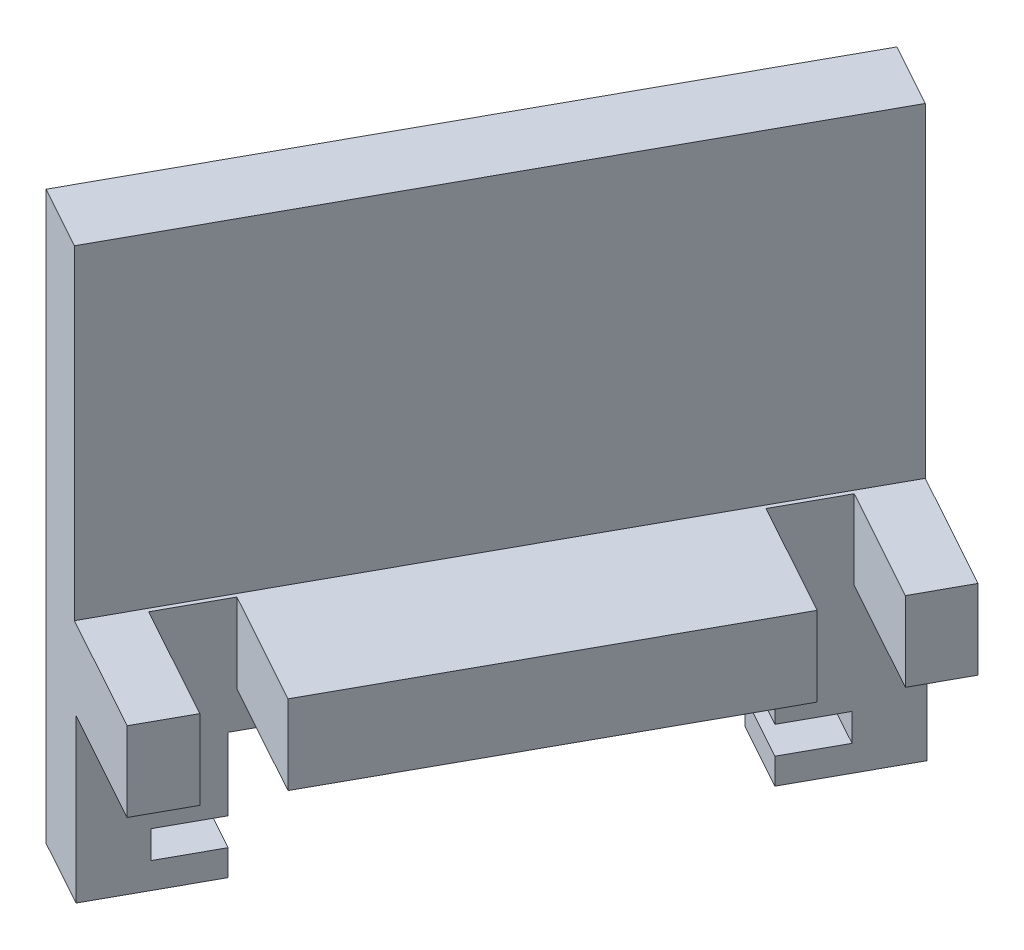
ISO-10303-21;
HEADER;
FILE_DESCRIPTION(('STEP AP214'),'2;1');
FILE_NAME('part.step','',(''),(''),'','','');
FILE_SCHEMA(('AUTOMOTIVE_DESIGN { 1 0 10303 214 1 1 1 1 }'));
ENDSEC;
DATA;
#1=APPLICATION_CONTEXT('core data for automotive mechanical design processes');
#2=APPLICATION_PROTOCOL_DEFINITION('international standard','automotive_design',2000,#1);
#3=PRODUCT_CONTEXT('',#1,'mechanical');
#4=PRODUCT('Part','Part','',(#3));
#5=PRODUCT_RELATED_PRODUCT_CATEGORY('part','',(#4));
#6=PRODUCT_DEFINITION_FORMATION('','',#4);
#7=PRODUCT_DEFINITION_CONTEXT('part definition',#1,'design');
#8=PRODUCT_DEFINITION('design','',#6,#7);
#9=PRODUCT_DEFINITION_SHAPE('','',#8);
#10=(LENGTH_UNIT() NAMED_UNIT(*) SI_UNIT(.MILLI.,.METRE.));
#11=(NAMED_UNIT(*) PLANE_ANGLE_UNIT() SI_UNIT($,.RADIAN.));
#12=(NAMED_UNIT(*) SI_UNIT($,.STERADIAN.) SOLID_ANGLE_UNIT());
#13=UNCERTAINTY_MEASURE_WITH_UNIT(LENGTH_MEASURE(1.E-05),#10,'distance_accuracy_value','');
#14=(GEOMETRIC_REPRESENTATION_CONTEXT(3) GLOBAL_UNCERTAINTY_ASSIGNED_CONTEXT((#13)) GLOBAL_UNIT_ASSIGNED_CONTEXT((#10,
#11,#12)) REPRESENTATION_CONTEXT('',''));
#15=CARTESIAN_POINT('',(0.,0.,0.));
#16=DIRECTION('',(0.,0.,1.));
#17=DIRECTION('',(1.,0.,0.));
#18=AXIS2_PLACEMENT_3D('',#15,#16,#17);
#19=CARTESIAN_POINT('',(7.4596693161832,2.54,-7.79648827545153));
#20=DIRECTION('',(0.,-1.,0.));
#21=DIRECTION('',(0.,0.,-1.));
#22=AXIS2_PLACEMENT_3D('',#19,#20,#21);
#23=PLANE('',#22);
#24=DIRECTION('',(0.482398684948692,0.,-0.875951773078731));
#25=VECTOR('',#24,1.);
#26=CARTESIAN_POINT('',(10.1140248846398,2.54,7.99073963190085));
#27=LINE('',#26,#25);
#28=CARTESIAN_POINT('',(-8.50168255991017,2.54,41.7936135864657));
#29=VERTEX_POINT('',#28);
#30=CARTESIAN_POINT('',(10.1140248846398,2.54,7.99073963190085));
#31=VERTEX_POINT('',#30);
#32=EDGE_CURVE('E58',#29,#31,#27,.T.);
#33=ORIENTED_EDGE('',*,*,#32,.F.);
#34=DIRECTION('',(-0.875951773078731,0.,-0.482398684948692));
#35=VECTOR('',#34,1.);
#36=CARTESIAN_POINT('',(-1.27061248190012,2.54,45.7758632988484));
#37=LINE('',#36,#35);
#38=CARTESIAN_POINT('',(-1.27061248190012,2.54,45.7758632988484));
#39=VERTEX_POINT('',#38);
#40=EDGE_CURVE('E490',#39,#29,#37,.T.);
#41=ORIENTED_EDGE('',*,*,#40,.F.);
#42=DIRECTION('',(-0.482398684948692,0.,0.875951773078731));
#43=VECTOR('',#42,1.);
#44=CARTESIAN_POINT('',(-1.27061248190012,2.54,45.7758632988484));
#45=LINE('',#44,#43);
#46=CARTESIAN_POINT('',(0.318862281195794,2.54,42.8896546908256));
#47=VERTEX_POINT('',#46);
#48=EDGE_CURVE('E485',#47,#39,#45,.T.);
#49=ORIENTED_EDGE('',*,*,#48,.F.);
#50=DIRECTION('',(-0.875951773078731,0.,-0.482398684948692));
#51=VECTOR('',#50,1.);
#52=CARTESIAN_POINT('',(-18.049164035007,2.54,32.7741300553811));
#53=LINE('',#52,#51);
#54=CARTESIAN_POINT('',(-6.68875190343405,2.54,39.0304652112361));
#55=VERTEX_POINT('',#54);
#56=EDGE_CURVE('E453',#47,#55,#53,.T.);
#57=ORIENTED_EDGE('',*,*,#56,.T.);
#58=DIRECTION('',(-0.482398684948693,0.,0.875951773078731));
#59=VECTOR('',#58,1.);
#60=CARTESIAN_POINT('',(-6.68875190343405,2.54,39.0304652112361));
#61=LINE('',#60,#59);
#62=CARTESIAN_POINT('',(-4.75915716363927,2.54,35.5266581189212));
#63=VERTEX_POINT('',#62);
#64=EDGE_CURVE('E405',#63,#55,#61,.T.);
#65=ORIENTED_EDGE('',*,*,#64,.F.);
#66=DIRECTION('',(0.875951773078731,0.,0.482398684948692));
#67=VECTOR('',#66,1.);
#68=CARTESIAN_POINT('',(-16.1195692952123,2.54,29.2703229630662));
#69=LINE('',#68,#67);
#70=CARTESIAN_POINT('',(2.24845702099057,2.54,39.3858475985107));
#71=VERTEX_POINT('',#70);
#72=EDGE_CURVE('E450',#63,#71,#69,.T.);
#73=ORIENTED_EDGE('',*,*,#72,.T.);
#74=CARTESIAN_POINT('',(13.8260254597592,2.54,18.3630050446212));
#75=VERTEX_POINT('',#74);
#76=EDGE_CURVE('E491',#75,#71,#45,.T.);
#77=ORIENTED_EDGE('',*,*,#76,.F.);
#78=DIRECTION('',(0.875951773078731,0.,0.482398684948692));
#79=VECTOR('',#78,1.);
#80=CARTESIAN_POINT('',(-4.54200085644365,2.54,8.24748040917667));
#81=LINE('',#80,#79);
#82=CARTESIAN_POINT('',(6.81841127512934,2.54,14.5038155650317));
#83=VERTEX_POINT('',#82);
#84=EDGE_CURVE('E449',#83,#75,#81,.T.);
#85=ORIENTED_EDGE('',*,*,#84,.F.);
#86=DIRECTION('',(-0.482398684948692,0.,0.875951773078731));
#87=VECTOR('',#86,1.);
#88=CARTESIAN_POINT('',(6.81841127512934,2.54,14.5038155650316));
#89=LINE('',#88,#87);
#90=CARTESIAN_POINT('',(8.74800601492411,2.54,11.0000084727167));
#91=VERTEX_POINT('',#90);
#92=EDGE_CURVE('E391',#91,#83,#89,.T.);
#93=ORIENTED_EDGE('',*,*,#92,.F.);
#94=DIRECTION('',(-0.875951773078731,0.,-0.482398684948692));
#95=VECTOR('',#94,1.);
#96=CARTESIAN_POINT('',(-2.61240611664888,2.54,4.74367331686174));
#97=LINE('',#96,#95);
#98=CARTESIAN_POINT('',(15.7556201995539,2.54,14.8591979523063));
#99=VERTEX_POINT('',#98);
#100=EDGE_CURVE('E468',#99,#91,#97,.T.);
#101=ORIENTED_EDGE('',*,*,#100,.F.);
#102=CARTESIAN_POINT('',(17.3450949626499,2.54,11.9729893442835));
#103=VERTEX_POINT('',#102);
#104=EDGE_CURVE('E486',#103,#99,#45,.T.);
#105=ORIENTED_EDGE('',*,*,#104,.F.);
#106=DIRECTION('',(-0.875951773078731,0.,-0.482398684948692));
#107=VECTOR('',#106,1.);
#108=CARTESIAN_POINT('',(17.3450949626499,2.54,11.9729893442835));
#109=LINE('',#108,#107);
#110=EDGE_CURVE('E497',#103,#31,#109,.T.);
#111=ORIENTED_EDGE('',*,*,#110,.T.);
#112=EDGE_LOOP('',(#33,#41,#49,#57,#65,#73,#77,#85,#93,#101,#105,#111));
#113=FACE_BOUND('',#112,.T.);
#114=ADVANCED_FACE('F43',(#113),#23,.F.);
#115=CARTESIAN_POINT('',(-1.27061248190012,-12.3551463158367,45.7758632988484));
#116=DIRECTION('',(0.,1.,0.));
#117=DIRECTION('',(0.,0.,1.));
#118=AXIS2_PLACEMENT_3D('',#115,#116,#117);
#119=PLANE('',#118);
#120=DIRECTION('',(0.482398684948692,0.,-0.875951773078731));
#121=VECTOR('',#120,1.);
#122=CARTESIAN_POINT('',(-12.3952,-12.3551463158367,39.6494));
#123=LINE('',#122,#121);
#124=CARTESIAN_POINT('',(-12.3952,-12.3551463158367,39.6494));
#125=VERTEX_POINT('',#124);
#126=CARTESIAN_POINT('',(-9.06908997108879,-12.3551463158367,33.6097650088938));
#127=VERTEX_POINT('',#126);
#128=EDGE_CURVE('E482',#125,#127,#123,.T.);
#129=ORIENTED_EDGE('',*,*,#128,.T.);
#130=DIRECTION('',(0.875951773078731,0.,0.482398684948692));
#131=VECTOR('',#130,1.);
#132=CARTESIAN_POINT('',(-37.7404541642711,-12.3551463158367,17.8200505433772));
#133=LINE('',#132,#131);
#134=CARTESIAN_POINT('',(-4.95211663761876,-12.3551463158367,35.8770388281527));
#135=VERTEX_POINT('',#134);
#136=EDGE_CURVE('E281',#127,#135,#133,.T.);
#137=ORIENTED_EDGE('',*,*,#136,.T.);
#138=DIRECTION('',(0.482398684948692,0.,-0.875951773078731));
#139=VECTOR('',#138,1.);
#140=CARTESIAN_POINT('',(10.33748077802,-12.3551463158367,8.113799864694));
#141=LINE('',#140,#139);
#142=CARTESIAN_POINT('',(-8.27822666652997,-12.3551463158367,41.9166738192588));
#143=VERTEX_POINT('',#142);
#144=EDGE_CURVE('E414',#143,#135,#141,.T.);
#145=ORIENTED_EDGE('',*,*,#144,.F.);
#146=DIRECTION('',(-0.875951773078731,0.,-0.482398684948692));
#147=VECTOR('',#146,1.);
#148=CARTESIAN_POINT('',(-1.27061248190012,-12.3551463158367,45.7758632988484));
#149=LINE('',#148,#147);
#150=EDGE_CURVE('E502',#143,#125,#149,.T.);
#151=ORIENTED_EDGE('',*,*,#150,.T.);
#152=EDGE_LOOP('',(#129,#137,#145,#151));
#153=FACE_BOUND('',#152,.T.);
#154=ADVANCED_FACE('F515',(#153),#119,.F.);
#155=CARTESIAN_POINT('',(-2.61240611664888,-28.5771616724208,4.74367331686174));
#156=DIRECTION('',(0.482398684948692,0.,-0.875951773078731));
#157=DIRECTION('',(-0.875951773078731,0.,-0.482398684948692));
#158=AXIS2_PLACEMENT_3D('',#155,#156,#157);
#159=PLANE('',#158);
#160=DIRECTION('',(0.,1.,0.));
#161=VECTOR('',#160,1.);
#162=CARTESIAN_POINT('',(8.74800601492411,2.54,11.0000084727167));
#163=LINE('',#162,#161);
#164=CARTESIAN_POINT('',(8.74800601492411,-2.35514631583674,11.0000084727167));
#165=VERTEX_POINT('',#164);
#166=EDGE_CURVE('E387',#165,#91,#163,.T.);
#167=ORIENTED_EDGE('',*,*,#166,.F.);
#168=DIRECTION('',(0.875951773078731,0.,0.482398684948692));
#169=VECTOR('',#168,1.);
#170=CARTESIAN_POINT('',(-2.61240611664888,-2.35514631583674,4.74367331686174));
#171=LINE('',#170,#169);
#172=CARTESIAN_POINT('',(15.7556201995539,-2.35514631583674,14.8591979523063));
#173=VERTEX_POINT('',#172);
#174=EDGE_CURVE('E445',#165,#173,#171,.T.);
#175=ORIENTED_EDGE('',*,*,#174,.T.);
#176=DIRECTION('',(0.,1.,0.));
#177=VECTOR('',#176,1.);
#178=CARTESIAN_POINT('',(15.7556201995539,-28.5771616724208,14.8591979523063));
#179=LINE('',#178,#177);
#180=EDGE_CURVE('E454',#173,#99,#179,.T.);
#181=ORIENTED_EDGE('',*,*,#180,.T.);
#182=ORIENTED_EDGE('',*,*,#100,.T.);
#183=EDGE_LOOP('',(#167,#175,#181,#182));
#184=FACE_BOUND('',#183,.T.);
#185=ADVANCED_FACE('F555',(#184),#159,.F.);
#186=CARTESIAN_POINT('',(-4.54200085644365,-28.5771616724208,8.24748040917667));
#187=DIRECTION('',(-0.482398684948692,0.,0.875951773078731));
#188=DIRECTION('',(0.875951773078731,0.,0.482398684948692));
#189=AXIS2_PLACEMENT_3D('',#186,#187,#188);
#190=PLANE('',#189);
#191=DIRECTION('',(0.,-1.,0.));
#192=VECTOR('',#191,1.);
#193=CARTESIAN_POINT('',(6.81841127512934,-12.3551463158367,14.5038155650317));
#194=LINE('',#193,#192);
#195=CARTESIAN_POINT('',(6.81841127512933,-2.35514631583674,14.5038155650316));
#196=VERTEX_POINT('',#195);
#197=EDGE_CURVE('E395',#83,#196,#194,.T.);
#198=ORIENTED_EDGE('',*,*,#197,.F.);
#199=ORIENTED_EDGE('',*,*,#84,.T.);
#200=DIRECTION('',(0.,1.,0.));
#201=VECTOR('',#200,1.);
#202=CARTESIAN_POINT('',(13.8260254597592,-28.5771616724208,18.3630050446212));
#203=LINE('',#202,#201);
#204=CARTESIAN_POINT('',(13.8260254597592,-2.35514631583674,18.3630050446212));
#205=VERTEX_POINT('',#204);
#206=EDGE_CURVE('E471',#205,#75,#203,.T.);
#207=ORIENTED_EDGE('',*,*,#206,.F.);
#208=DIRECTION('',(-0.875951773078731,0.,-0.482398684948692));
#209=VECTOR('',#208,1.);
#210=CARTESIAN_POINT('',(-4.54200085644365,-2.35514631583674,8.24748040917667));
#211=LINE('',#210,#209);
#212=EDGE_CURVE('E441',#205,#196,#211,.T.);
#213=ORIENTED_EDGE('',*,*,#212,.T.);
#214=EDGE_LOOP('',(#198,#199,#207,#213));
#215=FACE_BOUND('',#214,.T.);
#216=ADVANCED_FACE('F562',(#215),#190,.F.);
#217=CARTESIAN_POINT('',(-18.049164035007,-28.5771616724208,32.7741300553811));
#218=DIRECTION('',(0.482398684948692,0.,-0.875951773078731));
#219=DIRECTION('',(-0.875951773078731,0.,-0.482398684948692));
#220=AXIS2_PLACEMENT_3D('',#217,#218,#219);
#221=PLANE('',#220);
#222=DIRECTION('',(0.875951773078731,0.,0.482398684948692));
#223=VECTOR('',#222,1.);
#224=CARTESIAN_POINT('',(-18.049164035007,-2.35514631583674,32.7741300553811));
#225=LINE('',#224,#223);
#226=CARTESIAN_POINT('',(-6.68875190343405,-2.35514631583674,39.0304652112361));
#227=VERTEX_POINT('',#226);
#228=CARTESIAN_POINT('',(0.318862281195793,-2.35514631583674,42.8896546908256));
#229=VERTEX_POINT('',#228);
#230=EDGE_CURVE('E435',#227,#229,#225,.T.);
#231=ORIENTED_EDGE('',*,*,#230,.F.);
#232=DIRECTION('',(0.,-1.,0.));
#233=VECTOR('',#232,1.);
#234=CARTESIAN_POINT('',(-6.68875190343404,-12.3551463158367,39.0304652112361));
#235=LINE('',#234,#233);
#236=EDGE_CURVE('E399',#55,#227,#235,.T.);
#237=ORIENTED_EDGE('',*,*,#236,.F.);
#238=ORIENTED_EDGE('',*,*,#56,.F.);
#239=DIRECTION('',(0.,1.,0.));
#240=VECTOR('',#239,1.);
#241=CARTESIAN_POINT('',(0.318862281195794,-28.5771616724208,42.8896546908256));
#242=LINE('',#241,#240);
#243=EDGE_CURVE('E458',#229,#47,#242,.T.);
#244=ORIENTED_EDGE('',*,*,#243,.F.);
#245=EDGE_LOOP('',(#231,#237,#238,#244));
#246=FACE_BOUND('',#245,.T.);
#247=ADVANCED_FACE('F579',(#246),#221,.T.);
#248=CARTESIAN_POINT('',(-16.1195692952123,-28.5771616724208,29.2703229630662));
#249=DIRECTION('',(-0.482398684948692,0.,0.875951773078731));
#250=DIRECTION('',(0.875951773078731,0.,0.482398684948692));
#251=AXIS2_PLACEMENT_3D('',#248,#249,#250);
#252=PLANE('',#251);
#253=ORIENTED_EDGE('',*,*,#72,.F.);
#254=DIRECTION('',(0.,1.,0.));
#255=VECTOR('',#254,1.);
#256=CARTESIAN_POINT('',(-4.75915716363927,2.54,35.5266581189212));
#257=LINE('',#256,#255);
#258=CARTESIAN_POINT('',(-4.75915716363928,-2.35514631583674,35.5266581189212));
#259=VERTEX_POINT('',#258);
#260=EDGE_CURVE('E402',#259,#63,#257,.T.);
#261=ORIENTED_EDGE('',*,*,#260,.F.);
#262=DIRECTION('',(-0.875951773078731,0.,-0.482398684948692));
#263=VECTOR('',#262,1.);
#264=CARTESIAN_POINT('',(-16.1195692952123,-2.35514631583674,29.2703229630662));
#265=LINE('',#264,#263);
#266=CARTESIAN_POINT('',(2.24845702099057,-2.35514631583674,39.3858475985107));
#267=VERTEX_POINT('',#266);
#268=EDGE_CURVE('E11',#267,#259,#265,.T.);
#269=ORIENTED_EDGE('',*,*,#268,.F.);
#270=DIRECTION('',(0.,1.,0.));
#271=VECTOR('',#270,1.);
#272=CARTESIAN_POINT('',(2.24845702099057,-28.5771616724208,39.3858475985107));
#273=LINE('',#272,#271);
#274=EDGE_CURVE('E459',#267,#71,#273,.T.);
#275=ORIENTED_EDGE('',*,*,#274,.T.);
#276=EDGE_LOOP('',(#253,#261,#269,#275));
#277=FACE_BOUND('',#276,.T.);
#278=ADVANCED_FACE('F583',(#277),#252,.T.);
#279=CARTESIAN_POINT('',(7.01137074910881,-12.3551463158367,14.1534348558002));
#280=VERTEX_POINT('',#279);
#281=CARTESIAN_POINT('',(10.33748077802,-12.3551463158367,8.113799864694));
#282=VERTEX_POINT('',#281);
#283=EDGE_CURVE('E408',#280,#282,#141,.T.);
#284=ORIENTED_EDGE('',*,*,#283,.F.);
#285=DIRECTION('',(0.875951773078731,0.,0.482398684948692));
#286=VECTOR('',#285,1.);
#287=CARTESIAN_POINT('',(-25.7769667775435,-12.3551463158367,-3.90355342897531));
#288=LINE('',#287,#286);
#289=CARTESIAN_POINT('',(2.89439741563877,-12.3551463158367,11.8861610365413));
#290=VERTEX_POINT('',#289);
#291=EDGE_CURVE('E66',#290,#280,#288,.T.);
#292=ORIENTED_EDGE('',*,*,#291,.F.);
#293=CARTESIAN_POINT('',(6.22050744454997,-12.3551463158367,5.84652604543515));
#294=VERTEX_POINT('',#293);
#295=EDGE_CURVE('E463',#290,#294,#123,.T.);
#296=ORIENTED_EDGE('',*,*,#295,.T.);
#297=DIRECTION('',(-0.875951773078731,0.,-0.482398684948692));
#298=VECTOR('',#297,1.);
#299=CARTESIAN_POINT('',(17.3450949626499,-12.3551463158367,11.9729893442835));
#300=LINE('',#299,#298);
#301=EDGE_CURVE('E238',#282,#294,#300,.T.);
#302=ORIENTED_EDGE('',*,*,#301,.F.);
#303=EDGE_LOOP('',(#284,#292,#296,#302));
#304=FACE_BOUND('',#303,.T.);
#305=ADVANCED_FACE('F594',(#304),#119,.F.);
#306=CARTESIAN_POINT('',(18.3680263162028,0.,10.1155246354445));
#307=DIRECTION('',(0.875951773078731,0.,0.482398684948692));
#308=DIRECTION('',(0.482398684948692,0.,-0.875951773078731));
#309=AXIS2_PLACEMENT_3D('',#306,#307,#308);
#310=PLANE('',#309);
#311=DIRECTION('',(-0.482398684948692,0.,0.875951773078731));
#312=VECTOR('',#311,1.);
#313=CARTESIAN_POINT('',(-1.27061248190012,-2.35514631583674,45.7758632988484));
#314=LINE('',#313,#312);
#315=CARTESIAN_POINT('',(-1.27061248190012,-2.35514631583674,45.7758632988484));
#316=VERTEX_POINT('',#315);
#317=EDGE_CURVE('E423',#229,#316,#314,.T.);
#318=ORIENTED_EDGE('',*,*,#317,.F.);
#319=ORIENTED_EDGE('',*,*,#243,.T.);
#320=ORIENTED_EDGE('',*,*,#48,.T.);
#321=DIRECTION('',(0.,-1.,0.));
#322=VECTOR('',#321,1.);
#323=CARTESIAN_POINT('',(-1.27061248190012,2.54,45.7758632988484));
#324=LINE('',#323,#322);
#325=EDGE_CURVE('E477',#39,#316,#324,.T.);
#326=ORIENTED_EDGE('',*,*,#325,.T.);
#327=EDGE_LOOP('',(#318,#319,#320,#326));
#328=FACE_BOUND('',#327,.T.);
#329=ADVANCED_FACE('F534',(#328),#310,.T.);
#330=EDGE_CURVE('E428',#205,#267,#314,.T.);
#331=ORIENTED_EDGE('',*,*,#330,.F.);
#332=ORIENTED_EDGE('',*,*,#206,.T.);
#333=ORIENTED_EDGE('',*,*,#76,.T.);
#334=ORIENTED_EDGE('',*,*,#274,.F.);
#335=EDGE_LOOP('',(#331,#332,#333,#334));
#336=FACE_BOUND('',#335,.T.);
#337=ADVANCED_FACE('F565',(#336),#310,.T.);
#338=CARTESIAN_POINT('',(17.3450949626499,-2.35514631583674,11.9729893442835));
#339=VERTEX_POINT('',#338);
#340=EDGE_CURVE('E424',#339,#173,#314,.T.);
#341=ORIENTED_EDGE('',*,*,#340,.F.);
#342=DIRECTION('',(0.,1.,0.));
#343=VECTOR('',#342,1.);
#344=CARTESIAN_POINT('',(17.3450949626499,2.54,11.9729893442835));
#345=LINE('',#344,#343);
#346=EDGE_CURVE('E481',#339,#103,#345,.T.);
#347=ORIENTED_EDGE('',*,*,#346,.T.);
#348=ORIENTED_EDGE('',*,*,#104,.T.);
#349=ORIENTED_EDGE('',*,*,#180,.F.);
#350=EDGE_LOOP('',(#341,#347,#348,#349));
#351=FACE_BOUND('',#350,.T.);
#352=ADVANCED_FACE('F549',(#351),#310,.T.);
#353=CARTESIAN_POINT('',(7.24343879810294,0.,3.98906133659613));
#354=DIRECTION('',(0.875951773078731,0.,0.482398684948692));
#355=DIRECTION('',(0.482398684948692,0.,-0.875951773078731));
#356=AXIS2_PLACEMENT_3D('',#353,#354,#355);
#357=PLANE('',#356);
#358=DIRECTION('',(-0.482398684948692,0.,0.875951773078731));
#359=VECTOR('',#358,1.);
#360=CARTESIAN_POINT('',(-9.06908997108879,-10.7551463158367,33.6097650088938));
#361=LINE('',#360,#359);
#362=CARTESIAN_POINT('',(-9.06908997108879,-10.7551463158367,33.6097650088938));
#363=VERTEX_POINT('',#362);
#364=CARTESIAN_POINT('',(-10.7574853684092,-10.7551463158367,36.6755962146694));
#365=VERTEX_POINT('',#364);
#366=EDGE_CURVE('E302',#363,#365,#361,.T.);
#367=ORIENTED_EDGE('',*,*,#366,.F.);
#368=DIRECTION('',(0.,1.,0.));
#369=VECTOR('',#368,1.);
#370=CARTESIAN_POINT('',(-9.06908997108879,-12.3551463158367,33.6097650088938));
#371=LINE('',#370,#369);
#372=EDGE_CURVE('E305',#127,#363,#371,.T.);
#373=ORIENTED_EDGE('',*,*,#372,.F.);
#374=ORIENTED_EDGE('',*,*,#128,.F.);
#375=DIRECTION('',(0.,-1.,0.));
#376=VECTOR('',#375,1.);
#377=CARTESIAN_POINT('',(-12.3952,2.54,39.6494));
#378=LINE('',#377,#376);
#379=CARTESIAN_POINT('',(-12.3952,22.54,39.6494));
#380=VERTEX_POINT('',#379);
#381=EDGE_CURVE('E243',#380,#125,#378,.T.);
#382=ORIENTED_EDGE('',*,*,#381,.F.);
#383=DIRECTION('',(-0.482398684948692,0.,0.875951773078731));
#384=VECTOR('',#383,1.);
#385=CARTESIAN_POINT('',(6.22050744454997,22.54,5.84652604543515));
#386=LINE('',#385,#384);
#387=CARTESIAN_POINT('',(6.22050744454997,22.54,5.84652604543515));
#388=VERTEX_POINT('',#387);
#389=EDGE_CURVE('E245',#388,#380,#386,.T.);
#390=ORIENTED_EDGE('',*,*,#389,.F.);
#391=DIRECTION('',(0.,1.,0.));
#392=VECTOR('',#391,1.);
#393=CARTESIAN_POINT('',(6.22050744454997,2.54,5.84652604543515));
#394=LINE('',#393,#392);
#395=EDGE_CURVE('E51',#294,#388,#394,.T.);
#396=ORIENTED_EDGE('',*,*,#395,.F.);
#397=ORIENTED_EDGE('',*,*,#295,.F.);
#398=DIRECTION('',(0.,-1.,0.));
#399=VECTOR('',#398,1.);
#400=CARTESIAN_POINT('',(2.89439741563877,-12.3551463158367,11.8861610365413));
#401=LINE('',#400,#399);
#402=CARTESIAN_POINT('',(2.89439741563877,-10.7551463158367,11.8861610365413));
#403=VERTEX_POINT('',#402);
#404=EDGE_CURVE('E308',#403,#290,#401,.T.);
#405=ORIENTED_EDGE('',*,*,#404,.F.);
#406=DIRECTION('',(-0.482398684948692,0.,0.875951773078731));
#407=VECTOR('',#406,1.);
#408=CARTESIAN_POINT('',(2.89439741563877,-10.7551463158367,11.8861610365413));
#409=LINE('',#408,#407);
#410=CARTESIAN_POINT('',(4.5827928129592,-10.7551463158367,8.82032983076574));
#411=VERTEX_POINT('',#410);
#412=EDGE_CURVE('E277',#411,#403,#409,.T.);
#413=ORIENTED_EDGE('',*,*,#412,.F.);
#414=DIRECTION('',(0.,-1.,0.));
#415=VECTOR('',#414,1.);
#416=CARTESIAN_POINT('',(4.5827928129592,-10.7551463158367,8.82032983076574));
#417=LINE('',#416,#415);
#418=CARTESIAN_POINT('',(4.5827928129592,-9.05514631583674,8.82032983076574));
#419=VERTEX_POINT('',#418);
#420=EDGE_CURVE('E280',#419,#411,#417,.T.);
#421=ORIENTED_EDGE('',*,*,#420,.F.);
#422=DIRECTION('',(0.482398684948692,0.,-0.875951773078731));
#423=VECTOR('',#422,1.);
#424=CARTESIAN_POINT('',(4.5827928129592,-9.05514631583674,8.82032983076574));
#425=LINE('',#424,#423);
#426=CARTESIAN_POINT('',(2.89439741563877,-9.05514631583674,11.8861610365413));
#427=VERTEX_POINT('',#426);
#428=EDGE_CURVE('E284',#427,#419,#425,.T.);
#429=ORIENTED_EDGE('',*,*,#428,.F.);
#430=DIRECTION('',(0.,-1.,0.));
#431=VECTOR('',#430,1.);
#432=CARTESIAN_POINT('',(2.89439741563877,-9.05514631583674,11.8861610365413));
#433=LINE('',#432,#431);
#434=CARTESIAN_POINT('',(2.89439741563877,-4.60129516942955,11.8861610365413));
#435=VERTEX_POINT('',#434);
#436=EDGE_CURVE('E287',#435,#427,#433,.T.);
#437=ORIENTED_EDGE('',*,*,#436,.F.);
#438=DIRECTION('',(0.482398684948692,0.,-0.875951773078731));
#439=VECTOR('',#438,1.);
#440=CARTESIAN_POINT('',(2.89439741563877,-4.60129516942955,11.8861610365413));
#441=LINE('',#440,#439);
#442=CARTESIAN_POINT('',(-9.06908997108879,-4.60129516942955,33.6097650088938));
#443=VERTEX_POINT('',#442);
#444=EDGE_CURVE('E290',#443,#435,#441,.T.);
#445=ORIENTED_EDGE('',*,*,#444,.F.);
#446=DIRECTION('',(0.,1.,0.));
#447=VECTOR('',#446,1.);
#448=CARTESIAN_POINT('',(-9.06908997108879,-4.60129516942955,33.6097650088938));
#449=LINE('',#448,#447);
#450=CARTESIAN_POINT('',(-9.06908997108879,-9.05514631583674,33.6097650088938));
#451=VERTEX_POINT('',#450);
#452=EDGE_CURVE('E293',#451,#443,#449,.T.);
#453=ORIENTED_EDGE('',*,*,#452,.F.);
#454=DIRECTION('',(0.482398684948692,0.,-0.875951773078731));
#455=VECTOR('',#454,1.);
#456=CARTESIAN_POINT('',(-9.06908997108879,-9.05514631583674,33.6097650088938));
#457=LINE('',#456,#455);
#458=CARTESIAN_POINT('',(-10.7574853684092,-9.05514631583674,36.6755962146694));
#459=VERTEX_POINT('',#458);
#460=EDGE_CURVE('E296',#459,#451,#457,.T.);
#461=ORIENTED_EDGE('',*,*,#460,.F.);
#462=DIRECTION('',(0.,1.,0.));
#463=VECTOR('',#462,1.);
#464=CARTESIAN_POINT('',(-10.7574853684092,-9.05514631583674,36.6755962146694));
#465=LINE('',#464,#463);
#466=EDGE_CURVE('E299',#365,#459,#465,.T.);
#467=ORIENTED_EDGE('',*,*,#466,.F.);
#468=EDGE_LOOP('',(#367,#373,#374,#382,#390,#396,#397,#405,#413,#421,#429,#437,#445,#453,#461,#467));
#469=FACE_BOUND('',#468,.T.);
#470=ADVANCED_FACE('F247',(#469),#357,.F.);
#471=CARTESIAN_POINT('',(-1.27061248190012,2.54,45.7758632988484));
#472=DIRECTION('',(0.482398684948692,0.,-0.875951773078731));
#473=DIRECTION('',(-0.875951773078731,0.,-0.482398684948692));
#474=AXIS2_PLACEMENT_3D('',#471,#472,#473);
#475=PLANE('',#474);
#476=ORIENTED_EDGE('',*,*,#150,.F.);
#477=DIRECTION('',(0.,-1.,0.));
#478=VECTOR('',#477,1.);
#479=CARTESIAN_POINT('',(-8.27822666652997,-2.35514631583674,41.9166738192588));
#480=LINE('',#479,#478);
#481=CARTESIAN_POINT('',(-8.27822666652997,-2.35514631583674,41.9166738192588));
#482=VERTEX_POINT('',#481);
#483=EDGE_CURVE('E427',#482,#143,#480,.T.);
#484=ORIENTED_EDGE('',*,*,#483,.F.);
#485=DIRECTION('',(-0.875951773078731,0.,-0.482398684948692));
#486=VECTOR('',#485,1.);
#487=CARTESIAN_POINT('',(-8.27822666652997,-2.35514631583674,41.9166738192588));
#488=LINE('',#487,#486);
#489=EDGE_CURVE('E409',#316,#482,#488,.T.);
#490=ORIENTED_EDGE('',*,*,#489,.F.);
#491=ORIENTED_EDGE('',*,*,#325,.F.);
#492=ORIENTED_EDGE('',*,*,#40,.T.);
#493=DIRECTION('',(0.,-1.,0.));
#494=VECTOR('',#493,1.);
#495=CARTESIAN_POINT('',(-8.50168255991017,22.54,41.7936135864657));
#496=LINE('',#495,#494);
#497=CARTESIAN_POINT('',(-8.50168255991017,22.54,41.7936135864657));
#498=VERTEX_POINT('',#497);
#499=EDGE_CURVE('E272',#498,#29,#496,.T.);
#500=ORIENTED_EDGE('',*,*,#499,.F.);
#501=DIRECTION('',(0.875951773078731,0.,0.482398684948692));
#502=VECTOR('',#501,1.);
#503=CARTESIAN_POINT('',(-12.3952,22.54,39.6494));
#504=LINE('',#503,#502);
#505=EDGE_CURVE('E252',#380,#498,#504,.T.);
#506=ORIENTED_EDGE('',*,*,#505,.F.);
#507=ORIENTED_EDGE('',*,*,#381,.T.);
#508=EDGE_LOOP('',(#476,#484,#490,#491,#492,#500,#506,#507));
#509=FACE_BOUND('',#508,.T.);
#510=ADVANCED_FACE('F511',(#509),#475,.F.);
#511=CARTESIAN_POINT('',(17.3450949626499,2.54,11.9729893442835));
#512=DIRECTION('',(-0.482398684948692,0.,0.875951773078731));
#513=DIRECTION('',(0.875951773078731,0.,0.482398684948692));
#514=AXIS2_PLACEMENT_3D('',#511,#512,#513);
#515=PLANE('',#514);
#516=DIRECTION('',(0.875951773078731,0.,0.482398684948692));
#517=VECTOR('',#516,1.);
#518=CARTESIAN_POINT('',(17.3450949626499,-2.35514631583674,11.9729893442835));
#519=LINE('',#518,#517);
#520=CARTESIAN_POINT('',(10.33748077802,-2.35514631583674,8.113799864694));
#521=VERTEX_POINT('',#520);
#522=EDGE_CURVE('E419',#521,#339,#519,.T.);
#523=ORIENTED_EDGE('',*,*,#522,.F.);
#524=DIRECTION('',(0.,-1.,0.));
#525=VECTOR('',#524,1.);
#526=CARTESIAN_POINT('',(10.33748077802,-2.35514631583674,8.113799864694));
#527=LINE('',#526,#525);
#528=EDGE_CURVE('E432',#521,#282,#527,.T.);
#529=ORIENTED_EDGE('',*,*,#528,.T.);
#530=ORIENTED_EDGE('',*,*,#301,.T.);
#531=ORIENTED_EDGE('',*,*,#395,.T.);
#532=DIRECTION('',(-0.875951773078731,0.,-0.482398684948692));
#533=VECTOR('',#532,1.);
#534=CARTESIAN_POINT('',(6.22050744454997,22.54,5.84652604543515));
#535=LINE('',#534,#533);
#536=CARTESIAN_POINT('',(10.1140248846398,22.54,7.99073963190085));
#537=VERTEX_POINT('',#536);
#538=EDGE_CURVE('E235',#537,#388,#535,.T.);
#539=ORIENTED_EDGE('',*,*,#538,.F.);
#540=DIRECTION('',(0.,-1.,0.));
#541=VECTOR('',#540,1.);
#542=CARTESIAN_POINT('',(10.1140248846398,22.54,7.99073963190085));
#543=LINE('',#542,#541);
#544=EDGE_CURVE('E268',#537,#31,#543,.T.);
#545=ORIENTED_EDGE('',*,*,#544,.T.);
#546=ORIENTED_EDGE('',*,*,#110,.F.);
#547=ORIENTED_EDGE('',*,*,#346,.F.);
#548=EDGE_LOOP('',(#523,#529,#530,#531,#539,#545,#546,#547));
#549=FACE_BOUND('',#548,.T.);
#550=ADVANCED_FACE('F232',(#549),#515,.F.);
#551=CARTESIAN_POINT('',(0.,-2.35514631583674,0.));
#552=DIRECTION('',(0.,1.,0.));
#553=DIRECTION('',(0.,0.,1.));
#554=AXIS2_PLACEMENT_3D('',#551,#552,#553);
#555=PLANE('',#554);
#556=ORIENTED_EDGE('',*,*,#330,.T.);
#557=ORIENTED_EDGE('',*,*,#268,.T.);
#558=DIRECTION('',(0.482398684948692,0.,-0.875951773078731));
#559=VECTOR('',#558,1.);
#560=CARTESIAN_POINT('',(10.33748077802,-2.35514631583674,8.113799864694));
#561=LINE('',#560,#559);
#562=EDGE_CURVE('E420',#259,#196,#561,.T.);
#563=ORIENTED_EDGE('',*,*,#562,.T.);
#564=ORIENTED_EDGE('',*,*,#212,.F.);
#565=EDGE_LOOP('',(#556,#557,#563,#564));
#566=FACE_BOUND('',#565,.T.);
#567=ADVANCED_FACE('F585',(#566),#555,.F.);
#568=ORIENTED_EDGE('',*,*,#230,.T.);
#569=ORIENTED_EDGE('',*,*,#317,.T.);
#570=ORIENTED_EDGE('',*,*,#489,.T.);
#571=EDGE_CURVE('E415',#482,#227,#561,.T.);
#572=ORIENTED_EDGE('',*,*,#571,.T.);
#573=EDGE_LOOP('',(#568,#569,#570,#572));
#574=FACE_BOUND('',#573,.T.);
#575=ADVANCED_FACE('F575',(#574),#555,.F.);
#576=CARTESIAN_POINT('',(10.33748077802,-2.35514631583674,8.113799864694));
#577=DIRECTION('',(-0.875951773078731,0.,-0.482398684948692));
#578=DIRECTION('',(-0.482398684948692,0.,0.875951773078731));
#579=AXIS2_PLACEMENT_3D('',#576,#577,#578);
#580=PLANE('',#579);
#581=ORIENTED_EDGE('',*,*,#144,.T.);
#582=DIRECTION('',(0.,-1.,0.));
#583=VECTOR('',#582,1.);
#584=CARTESIAN_POINT('',(-4.95211663761876,-12.3551463158367,35.8770388281527));
#585=LINE('',#584,#583);
#586=CARTESIAN_POINT('',(-4.95211663761876,-10.7551463158367,35.8770388281527));
#587=VERTEX_POINT('',#586);
#588=EDGE_CURVE('E347',#587,#135,#585,.T.);
#589=ORIENTED_EDGE('',*,*,#588,.F.);
#590=DIRECTION('',(0.482398684948692,0.,-0.875951773078731));
#591=VECTOR('',#590,1.);
#592=CARTESIAN_POINT('',(-4.95211663761876,-10.7551463158367,35.8770388281527));
#593=LINE('',#592,#591);
#594=CARTESIAN_POINT('',(-6.64051203493918,-10.7551463158367,38.9428700339282));
#595=VERTEX_POINT('',#594);
#596=EDGE_CURVE('E343',#595,#587,#593,.T.);
#597=ORIENTED_EDGE('',*,*,#596,.F.);
#598=DIRECTION('',(0.,-1.,0.));
#599=VECTOR('',#598,1.);
#600=CARTESIAN_POINT('',(-6.64051203493918,-9.05514631583674,38.9428700339282));
#601=LINE('',#600,#599);
#602=CARTESIAN_POINT('',(-6.64051203493918,-9.05514631583674,38.9428700339282));
#603=VERTEX_POINT('',#602);
#604=EDGE_CURVE('E339',#603,#595,#601,.T.);
#605=ORIENTED_EDGE('',*,*,#604,.F.);
#606=DIRECTION('',(-0.482398684948692,0.,0.875951773078731));
#607=VECTOR('',#606,1.);
#608=CARTESIAN_POINT('',(-4.95211663761876,-9.05514631583674,35.8770388281527));
#609=LINE('',#608,#607);
#610=CARTESIAN_POINT('',(-4.95211663761876,-9.05514631583674,35.8770388281527));
#611=VERTEX_POINT('',#610);
#612=EDGE_CURVE('E335',#611,#603,#609,.T.);
#613=ORIENTED_EDGE('',*,*,#612,.F.);
#614=DIRECTION('',(0.,-1.,0.));
#615=VECTOR('',#614,1.);
#616=CARTESIAN_POINT('',(-4.95211663761876,-4.60129516942955,35.8770388281527));
#617=LINE('',#616,#615);
#618=CARTESIAN_POINT('',(-4.95211663761876,-4.60129516942955,35.8770388281527));
#619=VERTEX_POINT('',#618);
#620=EDGE_CURVE('E331',#619,#611,#617,.T.);
#621=ORIENTED_EDGE('',*,*,#620,.F.);
#622=DIRECTION('',(-0.482398684948692,0.,0.875951773078731));
#623=VECTOR('',#622,1.);
#624=CARTESIAN_POINT('',(7.01137074910881,-4.60129516942955,14.1534348558002));
#625=LINE('',#624,#623);
#626=CARTESIAN_POINT('',(7.01137074910881,-4.60129516942955,14.1534348558002));
#627=VERTEX_POINT('',#626);
#628=EDGE_CURVE('E327',#627,#619,#625,.T.);
#629=ORIENTED_EDGE('',*,*,#628,.F.);
#630=DIRECTION('',(0.,1.,0.));
#631=VECTOR('',#630,1.);
#632=CARTESIAN_POINT('',(7.01137074910881,-9.05514631583674,14.1534348558002));
#633=LINE('',#632,#631);
#634=CARTESIAN_POINT('',(7.01137074910881,-9.05514631583674,14.1534348558002));
#635=VERTEX_POINT('',#634);
#636=EDGE_CURVE('E323',#635,#627,#633,.T.);
#637=ORIENTED_EDGE('',*,*,#636,.F.);
#638=DIRECTION('',(-0.482398684948692,0.,0.875951773078731));
#639=VECTOR('',#638,1.);
#640=CARTESIAN_POINT('',(8.69976614642924,-9.05514631583674,11.0876036500246));
#641=LINE('',#640,#639);
#642=CARTESIAN_POINT('',(8.69976614642924,-9.05514631583674,11.0876036500246));
#643=VERTEX_POINT('',#642);
#644=EDGE_CURVE('E319',#643,#635,#641,.T.);
#645=ORIENTED_EDGE('',*,*,#644,.F.);
#646=DIRECTION('',(0.,1.,0.));
#647=VECTOR('',#646,1.);
#648=CARTESIAN_POINT('',(8.69976614642924,-10.7551463158367,11.0876036500246));
#649=LINE('',#648,#647);
#650=CARTESIAN_POINT('',(8.69976614642924,-10.7551463158367,11.0876036500246));
#651=VERTEX_POINT('',#650);
#652=EDGE_CURVE('E315',#651,#643,#649,.T.);
#653=ORIENTED_EDGE('',*,*,#652,.F.);
#654=DIRECTION('',(0.482398684948692,0.,-0.875951773078731));
#655=VECTOR('',#654,1.);
#656=CARTESIAN_POINT('',(7.01137074910881,-10.7551463158367,14.1534348558002));
#657=LINE('',#656,#655);
#658=CARTESIAN_POINT('',(7.01137074910881,-10.7551463158367,14.1534348558002));
#659=VERTEX_POINT('',#658);
#660=EDGE_CURVE('E311',#659,#651,#657,.T.);
#661=ORIENTED_EDGE('',*,*,#660,.F.);
#662=DIRECTION('',(0.,1.,0.));
#663=VECTOR('',#662,1.);
#664=CARTESIAN_POINT('',(7.01137074910881,-12.3551463158367,14.1534348558002));
#665=LINE('',#664,#663);
#666=EDGE_CURVE('E276',#280,#659,#665,.T.);
#667=ORIENTED_EDGE('',*,*,#666,.F.);
#668=ORIENTED_EDGE('',*,*,#283,.T.);
#669=ORIENTED_EDGE('',*,*,#528,.F.);
#670=EDGE_CURVE('E413',#165,#521,#561,.T.);
#671=ORIENTED_EDGE('',*,*,#670,.F.);
#672=ORIENTED_EDGE('',*,*,#166,.T.);
#673=ORIENTED_EDGE('',*,*,#92,.T.);
#674=ORIENTED_EDGE('',*,*,#197,.T.);
#675=ORIENTED_EDGE('',*,*,#562,.F.);
#676=ORIENTED_EDGE('',*,*,#260,.T.);
#677=ORIENTED_EDGE('',*,*,#64,.T.);
#678=ORIENTED_EDGE('',*,*,#236,.T.);
#679=ORIENTED_EDGE('',*,*,#571,.F.);
#680=ORIENTED_EDGE('',*,*,#483,.T.);
#681=EDGE_LOOP('',(#581,#589,#597,#605,#613,#621,#629,#637,#645,#653,#661,#667,#668,#669,#671,
#672,#673,#674,#675,#676,#677,#678,#679,#680));
#682=FACE_BOUND('',#681,.T.);
#683=ADVANCED_FACE('F528',(#682),#580,.F.);
#684=ORIENTED_EDGE('',*,*,#670,.T.);
#685=ORIENTED_EDGE('',*,*,#522,.T.);
#686=ORIENTED_EDGE('',*,*,#340,.T.);
#687=ORIENTED_EDGE('',*,*,#174,.F.);
#688=EDGE_LOOP('',(#684,#685,#686,#687));
#689=FACE_BOUND('',#688,.T.);
#690=ADVANCED_FACE('F552',(#689),#555,.F.);
#691=CARTESIAN_POINT('',(-37.7404541642711,-12.3551463158367,17.8200505433772));
#692=DIRECTION('',(-0.482398684948692,0.,0.875951773078731));
#693=DIRECTION('',(0.875951773078731,0.,0.482398684948692));
#694=AXIS2_PLACEMENT_3D('',#691,#692,#693);
#695=PLANE('',#694);
#696=ORIENTED_EDGE('',*,*,#372,.T.);
#697=DIRECTION('',(0.875951773078731,0.,0.482398684948692));
#698=VECTOR('',#697,1.);
#699=CARTESIAN_POINT('',(-37.7404541642711,-10.7551463158367,17.8200505433772));
#700=LINE('',#699,#698);
#701=EDGE_CURVE('E353',#363,#587,#700,.T.);
#702=ORIENTED_EDGE('',*,*,#701,.T.);
#703=ORIENTED_EDGE('',*,*,#588,.T.);
#704=ORIENTED_EDGE('',*,*,#136,.F.);
#705=EDGE_LOOP('',(#696,#702,#703,#704));
#706=FACE_BOUND('',#705,.T.);
#707=ADVANCED_FACE('F520',(#706),#695,.F.);
#708=CARTESIAN_POINT('',(-37.7404541642711,-10.7551463158367,17.8200505433772));
#709=DIRECTION('',(0.,-1.,0.));
#710=DIRECTION('',(0.,0.,-1.));
#711=AXIS2_PLACEMENT_3D('',#708,#709,#710);
#712=PLANE('',#711);
#713=ORIENTED_EDGE('',*,*,#366,.T.);
#714=DIRECTION('',(0.875951773078731,0.,0.482398684948692));
#715=VECTOR('',#714,1.);
#716=CARTESIAN_POINT('',(-39.4288495615915,-10.7551463158367,20.8858817491528));
#717=LINE('',#716,#715);
#718=EDGE_CURVE('E356',#365,#595,#717,.T.);
#719=ORIENTED_EDGE('',*,*,#718,.T.);
#720=ORIENTED_EDGE('',*,*,#596,.T.);
#721=ORIENTED_EDGE('',*,*,#701,.F.);
#722=EDGE_LOOP('',(#713,#719,#720,#721));
#723=FACE_BOUND('',#722,.T.);
#724=ADVANCED_FACE('F522',(#723),#712,.F.);
#725=CARTESIAN_POINT('',(-39.4288495615915,-9.05514631583674,20.8858817491528));
#726=DIRECTION('',(-0.482398684948692,0.,0.875951773078731));
#727=DIRECTION('',(0.875951773078731,0.,0.482398684948692));
#728=AXIS2_PLACEMENT_3D('',#725,#726,#727);
#729=PLANE('',#728);
#730=ORIENTED_EDGE('',*,*,#466,.T.);
#731=DIRECTION('',(0.875951773078731,0.,0.482398684948692));
#732=VECTOR('',#731,1.);
#733=CARTESIAN_POINT('',(-39.4288495615915,-9.05514631583674,20.8858817491528));
#734=LINE('',#733,#732);
#735=EDGE_CURVE('E359',#459,#603,#734,.T.);
#736=ORIENTED_EDGE('',*,*,#735,.T.);
#737=ORIENTED_EDGE('',*,*,#604,.T.);
#738=ORIENTED_EDGE('',*,*,#718,.F.);
#739=EDGE_LOOP('',(#730,#736,#737,#738));
#740=FACE_BOUND('',#739,.T.);
#741=ADVANCED_FACE('F793',(#740),#729,.F.);
#742=CARTESIAN_POINT('',(-37.7404541642711,-9.05514631583674,17.8200505433772));
#743=DIRECTION('',(0.,1.,0.));
#744=DIRECTION('',(0.,0.,1.));
#745=AXIS2_PLACEMENT_3D('',#742,#743,#744);
#746=PLANE('',#745);
#747=ORIENTED_EDGE('',*,*,#460,.T.);
#748=DIRECTION('',(0.875951773078731,0.,0.482398684948692));
#749=VECTOR('',#748,1.);
#750=CARTESIAN_POINT('',(-37.7404541642711,-9.05514631583674,17.8200505433772));
#751=LINE('',#750,#749);
#752=EDGE_CURVE('E362',#451,#611,#751,.T.);
#753=ORIENTED_EDGE('',*,*,#752,.T.);
#754=ORIENTED_EDGE('',*,*,#612,.T.);
#755=ORIENTED_EDGE('',*,*,#735,.F.);
#756=EDGE_LOOP('',(#747,#753,#754,#755));
#757=FACE_BOUND('',#756,.T.);
#758=ADVANCED_FACE('F790',(#757),#746,.F.);
#759=CARTESIAN_POINT('',(-37.7404541642711,-4.60129516942955,17.8200505433772));
#760=DIRECTION('',(-0.482398684948692,0.,0.875951773078731));
#761=DIRECTION('',(0.875951773078731,0.,0.482398684948692));
#762=AXIS2_PLACEMENT_3D('',#759,#760,#761);
#763=PLANE('',#762);
#764=ORIENTED_EDGE('',*,*,#452,.T.);
#765=DIRECTION('',(0.875951773078731,0.,0.482398684948692));
#766=VECTOR('',#765,1.);
#767=CARTESIAN_POINT('',(-37.7404541642711,-4.60129516942955,17.8200505433772));
#768=LINE('',#767,#766);
#769=EDGE_CURVE('E365',#443,#619,#768,.T.);
#770=ORIENTED_EDGE('',*,*,#769,.T.);
#771=ORIENTED_EDGE('',*,*,#620,.T.);
#772=ORIENTED_EDGE('',*,*,#752,.F.);
#773=EDGE_LOOP('',(#764,#770,#771,#772));
#774=FACE_BOUND('',#773,.T.);
#775=ADVANCED_FACE('F787',(#774),#763,.F.);
#776=CARTESIAN_POINT('',(-25.7769667775435,-4.60129516942955,-3.90355342897531));
#777=DIRECTION('',(0.,1.,0.));
#778=DIRECTION('',(0.,0.,1.));
#779=AXIS2_PLACEMENT_3D('',#776,#777,#778);
#780=PLANE('',#779);
#781=ORIENTED_EDGE('',*,*,#444,.T.);
#782=DIRECTION('',(0.875951773078731,0.,0.482398684948692));
#783=VECTOR('',#782,1.);
#784=CARTESIAN_POINT('',(-25.7769667775435,-4.60129516942955,-3.90355342897531));
#785=LINE('',#784,#783);
#786=EDGE_CURVE('E368',#435,#627,#785,.T.);
#787=ORIENTED_EDGE('',*,*,#786,.T.);
#788=ORIENTED_EDGE('',*,*,#628,.T.);
#789=ORIENTED_EDGE('',*,*,#769,.F.);
#790=EDGE_LOOP('',(#781,#787,#788,#789));
#791=FACE_BOUND('',#790,.T.);
#792=ADVANCED_FACE('F780',(#791),#780,.F.);
#793=CARTESIAN_POINT('',(-25.7769667775435,-9.05514631583674,-3.90355342897531));
#794=DIRECTION('',(0.482398684948692,0.,-0.875951773078731));
#795=DIRECTION('',(-0.875951773078731,0.,-0.482398684948692));
#796=AXIS2_PLACEMENT_3D('',#793,#794,#795);
#797=PLANE('',#796);
#798=ORIENTED_EDGE('',*,*,#436,.T.);
#799=DIRECTION('',(0.875951773078731,0.,0.482398684948692));
#800=VECTOR('',#799,1.);
#801=CARTESIAN_POINT('',(-25.7769667775435,-9.05514631583674,-3.90355342897531));
#802=LINE('',#801,#800);
#803=EDGE_CURVE('E371',#427,#635,#802,.T.);
#804=ORIENTED_EDGE('',*,*,#803,.T.);
#805=ORIENTED_EDGE('',*,*,#636,.T.);
#806=ORIENTED_EDGE('',*,*,#786,.F.);
#807=EDGE_LOOP('',(#798,#804,#805,#806));
#808=FACE_BOUND('',#807,.T.);
#809=ADVANCED_FACE('F776',(#808),#797,.F.);
#810=CARTESIAN_POINT('',(-24.0885713802231,-9.05514631583674,-6.96938463475087));
#811=DIRECTION('',(0.,1.,0.));
#812=DIRECTION('',(0.,0.,1.));
#813=AXIS2_PLACEMENT_3D('',#810,#811,#812);
#814=PLANE('',#813);
#815=ORIENTED_EDGE('',*,*,#428,.T.);
#816=DIRECTION('',(0.875951773078731,0.,0.482398684948692));
#817=VECTOR('',#816,1.);
#818=CARTESIAN_POINT('',(-24.0885713802231,-9.05514631583674,-6.96938463475087));
#819=LINE('',#818,#817);
#820=EDGE_CURVE('E374',#419,#643,#819,.T.);
#821=ORIENTED_EDGE('',*,*,#820,.T.);
#822=ORIENTED_EDGE('',*,*,#644,.T.);
#823=ORIENTED_EDGE('',*,*,#803,.F.);
#824=EDGE_LOOP('',(#815,#821,#822,#823));
#825=FACE_BOUND('',#824,.T.);
#826=ADVANCED_FACE('F773',(#825),#814,.F.);
#827=CARTESIAN_POINT('',(-24.0885713802231,-10.7551463158367,-6.96938463475087));
#828=DIRECTION('',(0.482398684948692,0.,-0.875951773078731));
#829=DIRECTION('',(-0.875951773078731,0.,-0.482398684948692));
#830=AXIS2_PLACEMENT_3D('',#827,#828,#829);
#831=PLANE('',#830);
#832=ORIENTED_EDGE('',*,*,#420,.T.);
#833=DIRECTION('',(0.875951773078731,0.,0.482398684948692));
#834=VECTOR('',#833,1.);
#835=CARTESIAN_POINT('',(-24.0885713802231,-10.7551463158367,-6.96938463475087));
#836=LINE('',#835,#834);
#837=EDGE_CURVE('E377',#411,#651,#836,.T.);
#838=ORIENTED_EDGE('',*,*,#837,.T.);
#839=ORIENTED_EDGE('',*,*,#652,.T.);
#840=ORIENTED_EDGE('',*,*,#820,.F.);
#841=EDGE_LOOP('',(#832,#838,#839,#840));
#842=FACE_BOUND('',#841,.T.);
#843=ADVANCED_FACE('F765',(#842),#831,.F.);
#844=CARTESIAN_POINT('',(-25.7769667775435,-10.7551463158367,-3.90355342897531));
#845=DIRECTION('',(0.,-1.,0.));
#846=DIRECTION('',(0.,0.,-1.));
#847=AXIS2_PLACEMENT_3D('',#844,#845,#846);
#848=PLANE('',#847);
#849=ORIENTED_EDGE('',*,*,#412,.T.);
#850=DIRECTION('',(0.875951773078731,0.,0.482398684948692));
#851=VECTOR('',#850,1.);
#852=CARTESIAN_POINT('',(-25.7769667775435,-10.7551463158367,-3.90355342897531));
#853=LINE('',#852,#851);
#854=EDGE_CURVE('E380',#403,#659,#853,.T.);
#855=ORIENTED_EDGE('',*,*,#854,.T.);
#856=ORIENTED_EDGE('',*,*,#660,.T.);
#857=ORIENTED_EDGE('',*,*,#837,.F.);
#858=EDGE_LOOP('',(#849,#855,#856,#857));
#859=FACE_BOUND('',#858,.T.);
#860=ADVANCED_FACE('F761',(#859),#848,.F.);
#861=CARTESIAN_POINT('',(-25.7769667775435,-12.3551463158367,-3.90355342897531));
#862=DIRECTION('',(0.482398684948692,0.,-0.875951773078731));
#863=DIRECTION('',(-0.875951773078731,0.,-0.482398684948692));
#864=AXIS2_PLACEMENT_3D('',#861,#862,#863);
#865=PLANE('',#864);
#866=ORIENTED_EDGE('',*,*,#404,.T.);
#867=ORIENTED_EDGE('',*,*,#291,.T.);
#868=ORIENTED_EDGE('',*,*,#666,.T.);
#869=ORIENTED_EDGE('',*,*,#854,.F.);
#870=EDGE_LOOP('',(#866,#867,#868,#869));
#871=FACE_BOUND('',#870,.T.);
#872=ADVANCED_FACE('F758',(#871),#865,.F.);
#873=CARTESIAN_POINT('',(10.1140248846398,22.54,7.99073963190085));
#874=DIRECTION('',(-0.875951773078731,0.,-0.482398684948692));
#875=DIRECTION('',(-0.482398684948692,0.,0.875951773078731));
#876=AXIS2_PLACEMENT_3D('',#873,#874,#875);
#877=PLANE('',#876);
#878=ORIENTED_EDGE('',*,*,#32,.T.);
#879=ORIENTED_EDGE('',*,*,#544,.F.);
#880=DIRECTION('',(0.482398684948692,0.,-0.875951773078731));
#881=VECTOR('',#880,1.);
#882=CARTESIAN_POINT('',(10.1140248846398,22.54,7.99073963190085));
#883=LINE('',#882,#881);
#884=EDGE_CURVE('E256',#498,#537,#883,.T.);
#885=ORIENTED_EDGE('',*,*,#884,.F.);
#886=ORIENTED_EDGE('',*,*,#499,.T.);
#887=EDGE_LOOP('',(#878,#879,#885,#886));
#888=FACE_BOUND('',#887,.T.);
#889=ADVANCED_FACE('F540',(#888),#877,.F.);
#890=CARTESIAN_POINT('',(0.,22.54,0.));
#891=DIRECTION('',(0.,-1.,0.));
#892=DIRECTION('',(0.,0.,-1.));
#893=AXIS2_PLACEMENT_3D('',#890,#891,#892);
#894=PLANE('',#893);
#895=ORIENTED_EDGE('',*,*,#538,.T.);
#896=ORIENTED_EDGE('',*,*,#389,.T.);
#897=ORIENTED_EDGE('',*,*,#505,.T.);
#898=ORIENTED_EDGE('',*,*,#884,.T.);
#899=EDGE_LOOP('',(#895,#896,#897,#898));
#900=FACE_BOUND('',#899,.T.);
#901=ADVANCED_FACE('F254',(#900),#894,.F.);
#902=CLOSED_SHELL('',(#114,#154,#185,#216,#247,#278,#305,#329,#337,#352,#470,#510,#550,#567,
#575,#683,#690,#707,#724,#741,#758,#775,#792,#809,#826,#843,#860,#872,#889,#901));
#903=MANIFOLD_SOLID_BREP('B2',#902);
#904=ADVANCED_BREP_SHAPE_REPRESENTATION('',(#18,#903),#14);
#905=SHAPE_DEFINITION_REPRESENTATION(#9,#904);
ENDSEC;
END-ISO-10303-21;
